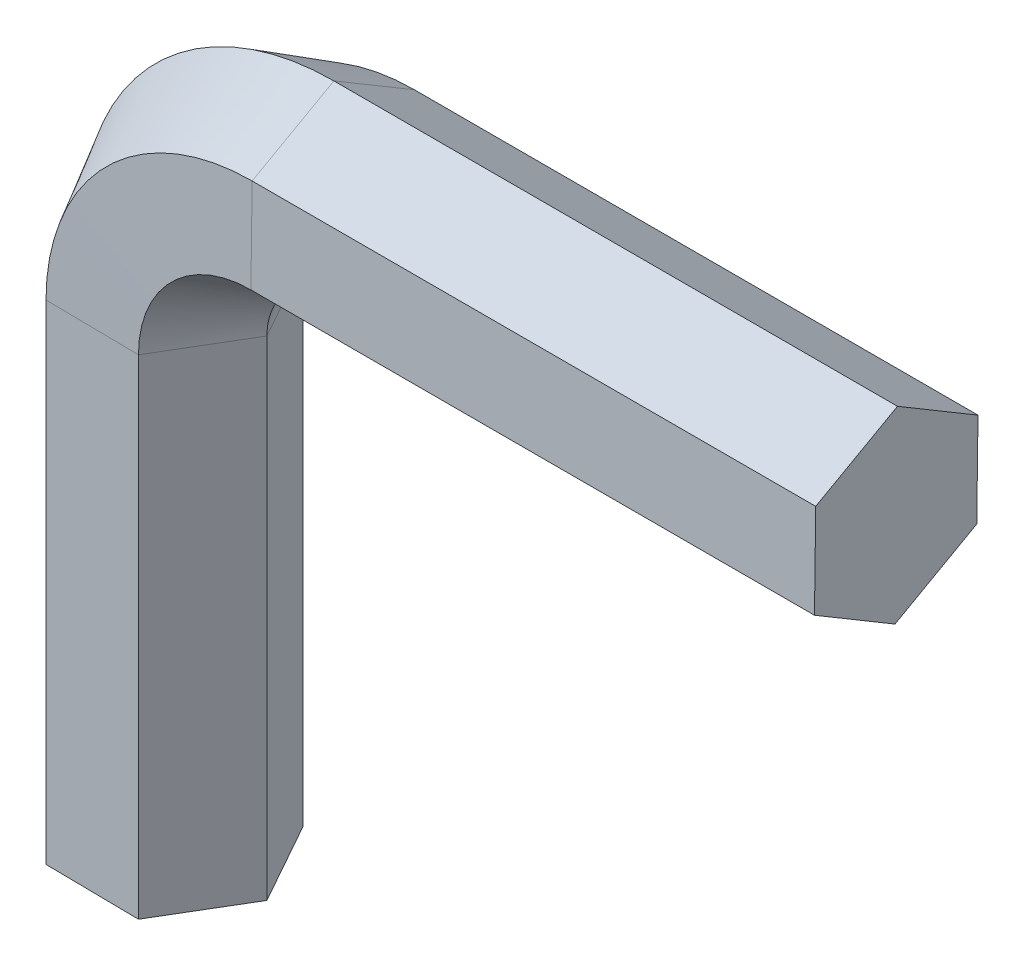
ISO-10303-21;
HEADER;
FILE_DESCRIPTION(('STEP AP214'),'2;1');
FILE_NAME('part.step','',(''),(''),'','','');
FILE_SCHEMA(('AUTOMOTIVE_DESIGN { 1 0 10303 214 1 1 1 1 }'));
ENDSEC;
DATA;
#1=APPLICATION_CONTEXT('core data for automotive mechanical design processes');
#2=APPLICATION_PROTOCOL_DEFINITION('international standard','automotive_design',2000,#1);
#3=PRODUCT_CONTEXT('',#1,'mechanical');
#4=PRODUCT('Part','Part','',(#3));
#5=PRODUCT_RELATED_PRODUCT_CATEGORY('part','',(#4));
#6=PRODUCT_DEFINITION_FORMATION('','',#4);
#7=PRODUCT_DEFINITION_CONTEXT('part definition',#1,'design');
#8=PRODUCT_DEFINITION('design','',#6,#7);
#9=PRODUCT_DEFINITION_SHAPE('','',#8);
#10=(LENGTH_UNIT() NAMED_UNIT(*) SI_UNIT(.MILLI.,.METRE.));
#11=(NAMED_UNIT(*) PLANE_ANGLE_UNIT() SI_UNIT($,.RADIAN.));
#12=(NAMED_UNIT(*) SI_UNIT($,.STERADIAN.) SOLID_ANGLE_UNIT());
#13=UNCERTAINTY_MEASURE_WITH_UNIT(LENGTH_MEASURE(1.E-05),#10,'distance_accuracy_value','');
#14=(GEOMETRIC_REPRESENTATION_CONTEXT(3) GLOBAL_UNCERTAINTY_ASSIGNED_CONTEXT((#13)) GLOBAL_UNIT_ASSIGNED_CONTEXT((#10,
#11,#12)) REPRESENTATION_CONTEXT('',''));
#15=CARTESIAN_POINT('',(0.,0.,0.));
#16=DIRECTION('',(0.,0.,1.));
#17=DIRECTION('',(1.,0.,0.));
#18=AXIS2_PLACEMENT_3D('',#15,#16,#17);
#19=CARTESIAN_POINT('',(0.,0.,0.));
#20=DIRECTION('',(0.,1.,0.));
#21=DIRECTION('',(0.,0.,1.));
#22=AXIS2_PLACEMENT_3D('',#19,#20,#21);
#23=PLANE('',#22);
#24=DIRECTION('',(0.999912109176475,0.,0.0132579757977503));
#25=VECTOR('',#24,1.);
#26=CARTESIAN_POINT('',(-4.46012358612205,0.,7.49392154961065));
#27=LINE('',#26,#25);
#28=CARTESIAN_POINT('',(-4.46012358612205,0.,7.49392154961065));
#29=VERTEX_POINT('',#28);
#30=CARTESIAN_POINT('',(4.25986464286943,0.,7.60954110440517));
#31=VERTEX_POINT('',#30);
#32=EDGE_CURVE('E198',#29,#31,#27,.T.);
#33=ORIENTED_EDGE('',*,*,#32,.F.);
#34=DIRECTION('',(0.488474310744626,0.,0.872578275997382));
#35=VECTOR('',#34,1.);
#36=CARTESIAN_POINT('',(-8.71998822899149,0.,-0.115619554794526));
#37=LINE('',#36,#35);
#38=CARTESIAN_POINT('',(-8.71998822899149,0.,-0.115619554794526));
#39=VERTEX_POINT('',#38);
#40=EDGE_CURVE('E260',#39,#29,#37,.T.);
#41=ORIENTED_EDGE('',*,*,#40,.F.);
#42=DIRECTION('',(-0.511437798431848,0.,0.859320300199631));
#43=VECTOR('',#42,1.);
#44=CARTESIAN_POINT('',(-4.25986464286944,0.,-7.60954110440517));
#45=LINE('',#44,#43);
#46=CARTESIAN_POINT('',(-4.25986464286944,0.,-7.60954110440517));
#47=VERTEX_POINT('',#46);
#48=EDGE_CURVE('E240',#47,#39,#45,.T.);
#49=ORIENTED_EDGE('',*,*,#48,.F.);
#50=DIRECTION('',(-0.999912109176475,0.,-0.0132579757977515));
#51=VECTOR('',#50,1.);
#52=CARTESIAN_POINT('',(4.46012358612204,0.,-7.49392154961064));
#53=LINE('',#52,#51);
#54=CARTESIAN_POINT('',(4.46012358612204,0.,-7.49392154961064));
#55=VERTEX_POINT('',#54);
#56=EDGE_CURVE('E145',#55,#47,#53,.T.);
#57=ORIENTED_EDGE('',*,*,#56,.F.);
#58=DIRECTION('',(-0.488474310744626,0.,-0.872578275997381));
#59=VECTOR('',#58,1.);
#60=CARTESIAN_POINT('',(8.71998822899148,0.,0.115619554794527));
#61=LINE('',#60,#59);
#62=CARTESIAN_POINT('',(8.71998822899148,0.,0.115619554794527));
#63=VERTEX_POINT('',#62);
#64=EDGE_CURVE('E149',#63,#55,#61,.T.);
#65=ORIENTED_EDGE('',*,*,#64,.F.);
#66=DIRECTION('',(0.511437798431849,0.,-0.859320300199631));
#67=VECTOR('',#66,1.);
#68=CARTESIAN_POINT('',(4.25986464286943,0.,7.60954110440517));
#69=LINE('',#68,#67);
#70=EDGE_CURVE('E154',#31,#63,#69,.T.);
#71=ORIENTED_EDGE('',*,*,#70,.F.);
#72=EDGE_LOOP('',(#33,#41,#49,#57,#65,#71));
#73=FACE_BOUND('',#72,.T.);
#74=ADVANCED_FACE('F43',(#73),#23,.F.);
#75=CARTESIAN_POINT('',(67.1770019025754,60.2210599732967,0.));
#76=DIRECTION('',(1.,0.,0.));
#77=DIRECTION('',(0.,0.,1.));
#78=AXIS2_PLACEMENT_3D('',#75,#76,#77);
#79=PLANE('',#78);
#80=DIRECTION('',(0.,-0.999912109176475,0.0132579757977503));
#81=VECTOR('',#80,1.);
#82=CARTESIAN_POINT('',(67.1770019025754,64.6811835594187,7.49392154961065));
#83=LINE('',#82,#81);
#84=CARTESIAN_POINT('',(67.1770019025754,64.6811835594187,7.49392154961065));
#85=VERTEX_POINT('',#84);
#86=CARTESIAN_POINT('',(67.1770019025754,55.9611953304272,7.60954110440517));
#87=VERTEX_POINT('',#86);
#88=EDGE_CURVE('E165',#85,#87,#83,.T.);
#89=ORIENTED_EDGE('',*,*,#88,.T.);
#90=DIRECTION('',(0.,-0.511437798431849,-0.859320300199631));
#91=VECTOR('',#90,1.);
#92=CARTESIAN_POINT('',(67.1770019025754,55.9611953304272,7.60954110440517));
#93=LINE('',#92,#91);
#94=CARTESIAN_POINT('',(67.1770019025754,51.5010717443052,0.115619554794527));
#95=VERTEX_POINT('',#94);
#96=EDGE_CURVE('E168',#87,#95,#93,.T.);
#97=ORIENTED_EDGE('',*,*,#96,.T.);
#98=DIRECTION('',(0.,0.488474310744626,-0.872578275997381));
#99=VECTOR('',#98,1.);
#100=CARTESIAN_POINT('',(67.1770019025754,51.5010717443052,0.115619554794527));
#101=LINE('',#100,#99);
#102=CARTESIAN_POINT('',(67.1770019025754,55.7609363871746,-7.49392154961064));
#103=VERTEX_POINT('',#102);
#104=EDGE_CURVE('E218',#95,#103,#101,.T.);
#105=ORIENTED_EDGE('',*,*,#104,.T.);
#106=DIRECTION('',(0.,0.999912109176475,-0.0132579757977515));
#107=VECTOR('',#106,1.);
#108=CARTESIAN_POINT('',(67.1770019025754,55.7609363871746,-7.49392154961064));
#109=LINE('',#108,#107);
#110=CARTESIAN_POINT('',(67.1770019025754,64.4809246161661,-7.60954110440517));
#111=VERTEX_POINT('',#110);
#112=EDGE_CURVE('E63',#103,#111,#109,.T.);
#113=ORIENTED_EDGE('',*,*,#112,.T.);
#114=DIRECTION('',(0.,0.511437798431848,0.859320300199631));
#115=VECTOR('',#114,1.);
#116=CARTESIAN_POINT('',(67.1770019025754,64.4809246161661,-7.60954110440517));
#117=LINE('',#116,#115);
#118=CARTESIAN_POINT('',(67.1770019025754,68.9410482022881,-0.115619554794526));
#119=VERTEX_POINT('',#118);
#120=EDGE_CURVE('E57',#111,#119,#117,.T.);
#121=ORIENTED_EDGE('',*,*,#120,.T.);
#122=DIRECTION('',(0.,-0.488474310744626,0.872578275997382));
#123=VECTOR('',#122,1.);
#124=CARTESIAN_POINT('',(67.1770019025754,68.9410482022881,-0.115619554794526));
#125=LINE('',#124,#123);
#126=EDGE_CURVE('E11',#119,#85,#125,.T.);
#127=ORIENTED_EDGE('',*,*,#126,.T.);
#128=EDGE_LOOP('',(#89,#97,#105,#113,#121,#127));
#129=FACE_BOUND('',#128,.T.);
#130=ADVANCED_FACE('F167',(#129),#79,.T.);
#131=CARTESIAN_POINT('',(-4.46012358612205,0.,7.49392154961065));
#132=DIRECTION('',(-0.0132579757977503,0.,0.999912109176475));
#133=DIRECTION('',(0.999912109176475,0.,0.0132579757977503));
#134=AXIS2_PLACEMENT_3D('',#131,#132,#133);
#135=PLANE('',#134);
#136=DIRECTION('',(0.,1.,0.));
#137=VECTOR('',#136,1.);
#138=CARTESIAN_POINT('',(4.25986464286943,0.,7.60954110440517));
#139=LINE('',#138,#137);
#140=CARTESIAN_POINT('',(4.25986464286943,45.4952210891904,7.60954110440517));
#141=VERTEX_POINT('',#140);
#142=EDGE_CURVE('E204',#31,#141,#139,.T.);
#143=ORIENTED_EDGE('',*,*,#142,.T.);
#144=DIRECTION('',(0.999912109176475,0.,0.0132579757977503));
#145=VECTOR('',#144,1.);
#146=CARTESIAN_POINT('',(-4.46012358612205,45.4952210891904,7.49392154961065));
#147=LINE('',#146,#145);
#148=CARTESIAN_POINT('',(-4.46012358612205,45.4952210891904,7.49392154961065));
#149=VERTEX_POINT('',#148);
#150=EDGE_CURVE('E305',#149,#141,#147,.T.);
#151=ORIENTED_EDGE('',*,*,#150,.F.);
#152=DIRECTION('',(0.,1.,0.));
#153=VECTOR('',#152,1.);
#154=CARTESIAN_POINT('',(-4.46012358612205,0.,7.49392154961065));
#155=LINE('',#154,#153);
#156=EDGE_CURVE('E281',#29,#149,#155,.T.);
#157=ORIENTED_EDGE('',*,*,#156,.F.);
#158=ORIENTED_EDGE('',*,*,#32,.T.);
#159=EDGE_LOOP('',(#143,#151,#157,#158));
#160=FACE_BOUND('',#159,.T.);
#161=ADVANCED_FACE('F315',(#160),#135,.T.);
#162=CARTESIAN_POINT('',(4.25986464286943,0.,7.60954110440517));
#163=DIRECTION('',(0.859320300199631,0.,0.511437798431849));
#164=DIRECTION('',(0.511437798431849,0.,-0.859320300199631));
#165=AXIS2_PLACEMENT_3D('',#162,#163,#164);
#166=PLANE('',#165);
#167=DIRECTION('',(0.,1.,0.));
#168=VECTOR('',#167,1.);
#169=CARTESIAN_POINT('',(8.71998822899148,0.,0.115619554794527));
#170=LINE('',#169,#168);
#171=CARTESIAN_POINT('',(8.71998822899148,45.4952210891904,0.115619554794527));
#172=VERTEX_POINT('',#171);
#173=EDGE_CURVE('E203',#63,#172,#170,.T.);
#174=ORIENTED_EDGE('',*,*,#173,.T.);
#175=DIRECTION('',(0.511437798431849,0.,-0.859320300199631));
#176=VECTOR('',#175,1.);
#177=CARTESIAN_POINT('',(4.25986464286943,45.4952210891904,7.60954110440517));
#178=LINE('',#177,#176);
#179=EDGE_CURVE('E199',#141,#172,#178,.T.);
#180=ORIENTED_EDGE('',*,*,#179,.F.);
#181=ORIENTED_EDGE('',*,*,#142,.F.);
#182=ORIENTED_EDGE('',*,*,#70,.T.);
#183=EDGE_LOOP('',(#174,#180,#181,#182));
#184=FACE_BOUND('',#183,.T.);
#185=ADVANCED_FACE('F318',(#184),#166,.T.);
#186=CARTESIAN_POINT('',(8.71998822899148,0.,0.115619554794527));
#187=DIRECTION('',(0.872578275997382,0.,-0.488474310744626));
#188=DIRECTION('',(-0.488474310744626,0.,-0.872578275997382));
#189=AXIS2_PLACEMENT_3D('',#186,#187,#188);
#190=PLANE('',#189);
#191=DIRECTION('',(0.,1.,0.));
#192=VECTOR('',#191,1.);
#193=CARTESIAN_POINT('',(4.46012358612204,0.,-7.49392154961064));
#194=LINE('',#193,#192);
#195=CARTESIAN_POINT('',(4.46012358612204,45.4952210891904,-7.49392154961064));
#196=VERTEX_POINT('',#195);
#197=EDGE_CURVE('E223',#55,#196,#194,.T.);
#198=ORIENTED_EDGE('',*,*,#197,.T.);
#199=DIRECTION('',(-0.488474310744626,0.,-0.872578275997381));
#200=VECTOR('',#199,1.);
#201=CARTESIAN_POINT('',(8.71998822899148,45.4952210891904,0.115619554794527));
#202=LINE('',#201,#200);
#203=EDGE_CURVE('E208',#172,#196,#202,.T.);
#204=ORIENTED_EDGE('',*,*,#203,.F.);
#205=ORIENTED_EDGE('',*,*,#173,.F.);
#206=ORIENTED_EDGE('',*,*,#64,.T.);
#207=EDGE_LOOP('',(#198,#204,#205,#206));
#208=FACE_BOUND('',#207,.T.);
#209=ADVANCED_FACE('F375',(#208),#190,.T.);
#210=CARTESIAN_POINT('',(4.46012358612204,0.,-7.49392154961064));
#211=DIRECTION('',(0.0132579757977515,0.,-0.999912109176475));
#212=DIRECTION('',(-0.999912109176475,0.,-0.0132579757977515));
#213=AXIS2_PLACEMENT_3D('',#210,#211,#212);
#214=PLANE('',#213);
#215=DIRECTION('',(0.,1.,0.));
#216=VECTOR('',#215,1.);
#217=CARTESIAN_POINT('',(-4.25986464286944,0.,-7.60954110440517));
#218=LINE('',#217,#216);
#219=CARTESIAN_POINT('',(-4.25986464286944,45.4952210891904,-7.60954110440517));
#220=VERTEX_POINT('',#219);
#221=EDGE_CURVE('E243',#47,#220,#218,.T.);
#222=ORIENTED_EDGE('',*,*,#221,.T.);
#223=DIRECTION('',(-0.999912109176475,0.,-0.0132579757977515));
#224=VECTOR('',#223,1.);
#225=CARTESIAN_POINT('',(4.46012358612204,45.4952210891904,-7.49392154961064));
#226=LINE('',#225,#224);
#227=EDGE_CURVE('E227',#196,#220,#226,.T.);
#228=ORIENTED_EDGE('',*,*,#227,.F.);
#229=ORIENTED_EDGE('',*,*,#197,.F.);
#230=ORIENTED_EDGE('',*,*,#56,.T.);
#231=EDGE_LOOP('',(#222,#228,#229,#230));
#232=FACE_BOUND('',#231,.T.);
#233=ADVANCED_FACE('F384',(#232),#214,.T.);
#234=CARTESIAN_POINT('',(-4.25986464286944,0.,-7.60954110440517));
#235=DIRECTION('',(-0.859320300199631,0.,-0.511437798431848));
#236=DIRECTION('',(-0.511437798431848,0.,0.859320300199631));
#237=AXIS2_PLACEMENT_3D('',#234,#235,#236);
#238=PLANE('',#237);
#239=DIRECTION('',(0.,1.,0.));
#240=VECTOR('',#239,1.);
#241=CARTESIAN_POINT('',(-8.71998822899149,0.,-0.115619554794526));
#242=LINE('',#241,#240);
#243=CARTESIAN_POINT('',(-8.71998822899149,45.4952210891904,-0.115619554794526));
#244=VERTEX_POINT('',#243);
#245=EDGE_CURVE('E263',#39,#244,#242,.T.);
#246=ORIENTED_EDGE('',*,*,#245,.T.);
#247=DIRECTION('',(-0.511437798431848,0.,0.859320300199631));
#248=VECTOR('',#247,1.);
#249=CARTESIAN_POINT('',(-4.25986464286944,45.4952210891904,-7.60954110440517));
#250=LINE('',#249,#248);
#251=EDGE_CURVE('E247',#220,#244,#250,.T.);
#252=ORIENTED_EDGE('',*,*,#251,.F.);
#253=ORIENTED_EDGE('',*,*,#221,.F.);
#254=ORIENTED_EDGE('',*,*,#48,.T.);
#255=EDGE_LOOP('',(#246,#252,#253,#254));
#256=FACE_BOUND('',#255,.T.);
#257=ADVANCED_FACE('F395',(#256),#238,.T.);
#258=CARTESIAN_POINT('',(-8.71998822899149,0.,-0.115619554794526));
#259=DIRECTION('',(-0.872578275997382,0.,0.488474310744626));
#260=DIRECTION('',(0.488474310744626,0.,0.872578275997382));
#261=AXIS2_PLACEMENT_3D('',#258,#259,#260);
#262=PLANE('',#261);
#263=DIRECTION('',(0.488474310744626,0.,0.872578275997382));
#264=VECTOR('',#263,1.);
#265=CARTESIAN_POINT('',(-8.71998822899149,45.4952210891904,-0.115619554794526));
#266=LINE('',#265,#264);
#267=EDGE_CURVE('E267',#244,#149,#266,.T.);
#268=ORIENTED_EDGE('',*,*,#267,.F.);
#269=ORIENTED_EDGE('',*,*,#245,.F.);
#270=ORIENTED_EDGE('',*,*,#40,.T.);
#271=ORIENTED_EDGE('',*,*,#156,.T.);
#272=EDGE_LOOP('',(#268,#269,#270,#271));
#273=FACE_BOUND('',#272,.T.);
#274=ADVANCED_FACE('F331',(#273),#262,.T.);
#275=CARTESIAN_POINT('',(14.7258388841062,45.4952210891904,7.49392154961065));
#276=DIRECTION('',(0.,0.,-1.));
#277=DIRECTION('',(-1.,0.,0.));
#278=AXIS2_PLACEMENT_3D('',#275,#276,#277);
#279=CONICAL_SURFACE('',#278,19.1859624702283,1.55753796256535);
#280=CARTESIAN_POINT('',(14.7258388841062,45.4952210891904,7.60954110440517));
#281=DIRECTION('',(0.,0.,-1.));
#282=DIRECTION('',(-1.,0.,0.));
#283=AXIS2_PLACEMENT_3D('',#280,#281,#282);
#284=CIRCLE('',#283,10.4659742412368);
#285=CARTESIAN_POINT('',(14.7258388841062,55.9611953304272,7.60954110440517));
#286=VERTEX_POINT('',#285);
#287=EDGE_CURVE('E212',#141,#286,#284,.T.);
#288=ORIENTED_EDGE('',*,*,#287,.T.);
#289=DIRECTION('',(0.,-0.999912109176475,0.0132579757977503));
#290=VECTOR('',#289,1.);
#291=CARTESIAN_POINT('',(14.7258388841062,64.6811835594187,7.49392154961065));
#292=LINE('',#291,#290);
#293=CARTESIAN_POINT('',(14.7258388841062,64.6811835594187,7.49392154961065));
#294=VERTEX_POINT('',#293);
#295=EDGE_CURVE('E188',#294,#286,#292,.T.);
#296=ORIENTED_EDGE('',*,*,#295,.F.);
#297=CARTESIAN_POINT('',(14.7258388841062,45.4952210891904,7.49392154961065));
#298=DIRECTION('',(0.,0.,-1.));
#299=DIRECTION('',(-1.,0.,0.));
#300=AXIS2_PLACEMENT_3D('',#297,#298,#299);
#301=CIRCLE('',#300,19.1859624702283);
#302=EDGE_CURVE('E284',#149,#294,#301,.T.);
#303=ORIENTED_EDGE('',*,*,#302,.F.);
#304=ORIENTED_EDGE('',*,*,#150,.T.);
#305=EDGE_LOOP('',(#288,#296,#303,#304));
#306=FACE_BOUND('',#305,.T.);
#307=ADVANCED_FACE('F291',(#306),#279,.T.);
#308=CARTESIAN_POINT('',(14.7258388841062,45.4952210891904,7.60954110440517));
#309=DIRECTION('',(0.,0.,1.));
#310=DIRECTION('',(1.,0.,0.));
#311=AXIS2_PLACEMENT_3D('',#308,#309,#310);
#312=CONICAL_SURFACE('',#311,10.4659742412368,0.536857139827842);
#313=CARTESIAN_POINT('',(14.7258388841062,45.4952210891904,0.115619554794527));
#314=DIRECTION('',(0.,0.,-1.));
#315=DIRECTION('',(-1.,0.,0.));
#316=AXIS2_PLACEMENT_3D('',#313,#314,#315);
#317=CIRCLE('',#316,6.00585065511476);
#318=CARTESIAN_POINT('',(14.7258388841062,51.5010717443052,0.115619554794527));
#319=VERTEX_POINT('',#318);
#320=EDGE_CURVE('E132',#172,#319,#317,.T.);
#321=ORIENTED_EDGE('',*,*,#320,.T.);
#322=DIRECTION('',(0.,-0.511437798431849,-0.859320300199631));
#323=VECTOR('',#322,1.);
#324=CARTESIAN_POINT('',(14.7258388841062,55.9611953304272,7.60954110440517));
#325=LINE('',#324,#323);
#326=EDGE_CURVE('E209',#286,#319,#325,.T.);
#327=ORIENTED_EDGE('',*,*,#326,.F.);
#328=ORIENTED_EDGE('',*,*,#287,.F.);
#329=ORIENTED_EDGE('',*,*,#179,.T.);
#330=EDGE_LOOP('',(#321,#327,#328,#329));
#331=FACE_BOUND('',#330,.T.);
#332=ADVANCED_FACE('F321',(#331),#312,.F.);
#333=CARTESIAN_POINT('',(14.7258388841062,45.4952210891904,0.115619554794527));
#334=DIRECTION('',(0.,0.,-1.));
#335=DIRECTION('',(-1.,0.,0.));
#336=AXIS2_PLACEMENT_3D('',#333,#334,#335);
#337=CONICAL_SURFACE('',#336,6.00585065511476,0.510340411368755);
#338=CARTESIAN_POINT('',(14.7258388841062,45.4952210891904,-7.49392154961064));
#339=DIRECTION('',(0.,0.,-1.));
#340=DIRECTION('',(-1.,0.,0.));
#341=AXIS2_PLACEMENT_3D('',#338,#339,#340);
#342=CIRCLE('',#341,10.2657152979842);
#343=CARTESIAN_POINT('',(14.7258388841062,55.7609363871746,-7.49392154961064));
#344=VERTEX_POINT('',#343);
#345=EDGE_CURVE('E123',#196,#344,#342,.T.);
#346=ORIENTED_EDGE('',*,*,#345,.T.);
#347=DIRECTION('',(0.,0.488474310744626,-0.872578275997381));
#348=VECTOR('',#347,1.);
#349=CARTESIAN_POINT('',(14.7258388841062,51.5010717443052,0.115619554794527));
#350=LINE('',#349,#348);
#351=EDGE_CURVE('E214',#319,#344,#350,.T.);
#352=ORIENTED_EDGE('',*,*,#351,.F.);
#353=ORIENTED_EDGE('',*,*,#320,.F.);
#354=ORIENTED_EDGE('',*,*,#203,.T.);
#355=EDGE_LOOP('',(#346,#352,#353,#354));
#356=FACE_BOUND('',#355,.T.);
#357=ADVANCED_FACE('F323',(#356),#337,.F.);
#358=CARTESIAN_POINT('',(14.7258388841062,45.4952210891904,-7.49392154961064));
#359=DIRECTION('',(0.,0.,-1.));
#360=DIRECTION('',(-1.,0.,0.));
#361=AXIS2_PLACEMENT_3D('',#358,#359,#360);
#362=CONICAL_SURFACE('',#361,10.2657152979842,1.55753796256535);
#363=CARTESIAN_POINT('',(14.7258388841062,45.4952210891904,-7.60954110440517));
#364=DIRECTION('',(0.,0.,-1.));
#365=DIRECTION('',(-1.,0.,0.));
#366=AXIS2_PLACEMENT_3D('',#363,#364,#365);
#367=CIRCLE('',#366,18.9857035269757);
#368=CARTESIAN_POINT('',(14.7258388841062,64.4809246161661,-7.60954110440517));
#369=VERTEX_POINT('',#368);
#370=EDGE_CURVE('E116',#220,#369,#367,.T.);
#371=ORIENTED_EDGE('',*,*,#370,.T.);
#372=DIRECTION('',(0.,0.999912109176475,-0.0132579757977515));
#373=VECTOR('',#372,1.);
#374=CARTESIAN_POINT('',(14.7258388841062,55.7609363871746,-7.49392154961064));
#375=LINE('',#374,#373);
#376=EDGE_CURVE('E233',#344,#369,#375,.T.);
#377=ORIENTED_EDGE('',*,*,#376,.F.);
#378=ORIENTED_EDGE('',*,*,#345,.F.);
#379=ORIENTED_EDGE('',*,*,#227,.T.);
#380=EDGE_LOOP('',(#371,#377,#378,#379));
#381=FACE_BOUND('',#380,.T.);
#382=ADVANCED_FACE('F329',(#381),#362,.F.);
#383=CARTESIAN_POINT('',(14.7258388841062,45.4952210891904,-7.60954110440517));
#384=DIRECTION('',(0.,0.,1.));
#385=DIRECTION('',(1.,0.,0.));
#386=AXIS2_PLACEMENT_3D('',#383,#384,#385);
#387=CONICAL_SURFACE('',#386,18.9857035269757,0.536857139827842);
#388=CARTESIAN_POINT('',(14.7258388841062,45.4952210891904,-0.115619554794526));
#389=DIRECTION('',(0.,0.,-1.));
#390=DIRECTION('',(-1.,0.,0.));
#391=AXIS2_PLACEMENT_3D('',#388,#389,#390);
#392=CIRCLE('',#391,23.4458271130977);
#393=CARTESIAN_POINT('',(14.7258388841062,68.9410482022881,-0.115619554794526));
#394=VERTEX_POINT('',#393);
#395=EDGE_CURVE('E270',#244,#394,#392,.T.);
#396=ORIENTED_EDGE('',*,*,#395,.T.);
#397=DIRECTION('',(0.,0.511437798431848,0.859320300199631));
#398=VECTOR('',#397,1.);
#399=CARTESIAN_POINT('',(14.7258388841062,64.4809246161661,-7.60954110440517));
#400=LINE('',#399,#398);
#401=EDGE_CURVE('E252',#369,#394,#400,.T.);
#402=ORIENTED_EDGE('',*,*,#401,.F.);
#403=ORIENTED_EDGE('',*,*,#370,.F.);
#404=ORIENTED_EDGE('',*,*,#251,.T.);
#405=EDGE_LOOP('',(#396,#402,#403,#404));
#406=FACE_BOUND('',#405,.T.);
#407=ADVANCED_FACE('F444',(#406),#387,.T.);
#408=CARTESIAN_POINT('',(14.7258388841062,45.4952210891904,-0.115619554794526));
#409=DIRECTION('',(0.,0.,-1.));
#410=DIRECTION('',(-1.,0.,0.));
#411=AXIS2_PLACEMENT_3D('',#408,#409,#410);
#412=CONICAL_SURFACE('',#411,23.4458271130977,0.510340411368755);
#413=DIRECTION('',(0.,-0.488474310744626,0.872578275997382));
#414=VECTOR('',#413,1.);
#415=CARTESIAN_POINT('',(14.7258388841062,68.9410482022881,-0.115619554794526));
#416=LINE('',#415,#414);
#417=EDGE_CURVE('E195',#394,#294,#416,.T.);
#418=ORIENTED_EDGE('',*,*,#417,.F.);
#419=ORIENTED_EDGE('',*,*,#395,.F.);
#420=ORIENTED_EDGE('',*,*,#267,.T.);
#421=ORIENTED_EDGE('',*,*,#302,.T.);
#422=EDGE_LOOP('',(#418,#419,#420,#421));
#423=FACE_BOUND('',#422,.T.);
#424=ADVANCED_FACE('F295',(#423),#412,.T.);
#425=CARTESIAN_POINT('',(14.7258388841062,64.6811835594187,7.49392154961065));
#426=DIRECTION('',(0.,0.0132579757977503,0.999912109176475));
#427=DIRECTION('',(0.,-0.999912109176475,0.0132579757977503));
#428=AXIS2_PLACEMENT_3D('',#425,#426,#427);
#429=PLANE('',#428);
#430=DIRECTION('',(1.,0.,0.));
#431=VECTOR('',#430,1.);
#432=CARTESIAN_POINT('',(14.7258388841062,55.9611953304272,7.60954110440517));
#433=LINE('',#432,#431);
#434=EDGE_CURVE('E174',#286,#87,#433,.T.);
#435=ORIENTED_EDGE('',*,*,#434,.T.);
#436=ORIENTED_EDGE('',*,*,#88,.F.);
#437=DIRECTION('',(1.,0.,0.));
#438=VECTOR('',#437,1.);
#439=CARTESIAN_POINT('',(14.7258388841062,64.6811835594187,7.49392154961065));
#440=LINE('',#439,#438);
#441=EDGE_CURVE('E175',#294,#85,#440,.T.);
#442=ORIENTED_EDGE('',*,*,#441,.F.);
#443=ORIENTED_EDGE('',*,*,#295,.T.);
#444=EDGE_LOOP('',(#435,#436,#442,#443));
#445=FACE_BOUND('',#444,.T.);
#446=ADVANCED_FACE('F186',(#445),#429,.T.);
#447=CARTESIAN_POINT('',(14.7258388841062,55.9611953304272,7.60954110440517));
#448=DIRECTION('',(0.,-0.859320300199631,0.511437798431849));
#449=DIRECTION('',(0.,-0.511437798431849,-0.859320300199631));
#450=AXIS2_PLACEMENT_3D('',#447,#448,#449);
#451=PLANE('',#450);
#452=DIRECTION('',(1.,0.,0.));
#453=VECTOR('',#452,1.);
#454=CARTESIAN_POINT('',(14.7258388841062,51.5010717443052,0.115619554794527));
#455=LINE('',#454,#453);
#456=EDGE_CURVE('E182',#319,#95,#455,.T.);
#457=ORIENTED_EDGE('',*,*,#456,.T.);
#458=ORIENTED_EDGE('',*,*,#96,.F.);
#459=ORIENTED_EDGE('',*,*,#434,.F.);
#460=ORIENTED_EDGE('',*,*,#326,.T.);
#461=EDGE_LOOP('',(#457,#458,#459,#460));
#462=FACE_BOUND('',#461,.T.);
#463=ADVANCED_FACE('F179',(#462),#451,.T.);
#464=CARTESIAN_POINT('',(14.7258388841062,51.5010717443052,0.115619554794527));
#465=DIRECTION('',(0.,-0.872578275997382,-0.488474310744626));
#466=DIRECTION('',(0.,0.488474310744626,-0.872578275997382));
#467=AXIS2_PLACEMENT_3D('',#464,#465,#466);
#468=PLANE('',#467);
#469=DIRECTION('',(1.,0.,0.));
#470=VECTOR('',#469,1.);
#471=CARTESIAN_POINT('',(14.7258388841062,55.7609363871746,-7.49392154961064));
#472=LINE('',#471,#470);
#473=EDGE_CURVE('E101',#344,#103,#472,.T.);
#474=ORIENTED_EDGE('',*,*,#473,.T.);
#475=ORIENTED_EDGE('',*,*,#104,.F.);
#476=ORIENTED_EDGE('',*,*,#456,.F.);
#477=ORIENTED_EDGE('',*,*,#351,.T.);
#478=EDGE_LOOP('',(#474,#475,#476,#477));
#479=FACE_BOUND('',#478,.T.);
#480=ADVANCED_FACE('F480',(#479),#468,.T.);
#481=CARTESIAN_POINT('',(14.7258388841062,55.7609363871746,-7.49392154961064));
#482=DIRECTION('',(0.,-0.0132579757977515,-0.999912109176475));
#483=DIRECTION('',(0.,0.999912109176475,-0.0132579757977515));
#484=AXIS2_PLACEMENT_3D('',#481,#482,#483);
#485=PLANE('',#484);
#486=DIRECTION('',(1.,0.,0.));
#487=VECTOR('',#486,1.);
#488=CARTESIAN_POINT('',(14.7258388841062,64.4809246161661,-7.60954110440517));
#489=LINE('',#488,#487);
#490=EDGE_CURVE('E93',#369,#111,#489,.T.);
#491=ORIENTED_EDGE('',*,*,#490,.T.);
#492=ORIENTED_EDGE('',*,*,#112,.F.);
#493=ORIENTED_EDGE('',*,*,#473,.F.);
#494=ORIENTED_EDGE('',*,*,#376,.T.);
#495=EDGE_LOOP('',(#491,#492,#493,#494));
#496=FACE_BOUND('',#495,.T.);
#497=ADVANCED_FACE('F341',(#496),#485,.T.);
#498=CARTESIAN_POINT('',(14.7258388841062,64.4809246161661,-7.60954110440517));
#499=DIRECTION('',(0.,0.859320300199631,-0.511437798431848));
#500=DIRECTION('',(0.,0.511437798431848,0.859320300199631));
#501=AXIS2_PLACEMENT_3D('',#498,#499,#500);
#502=PLANE('',#501);
#503=DIRECTION('',(1.,0.,0.));
#504=VECTOR('',#503,1.);
#505=CARTESIAN_POINT('',(14.7258388841062,68.9410482022881,-0.115619554794526));
#506=LINE('',#505,#504);
#507=EDGE_CURVE('E51',#394,#119,#506,.T.);
#508=ORIENTED_EDGE('',*,*,#507,.T.);
#509=ORIENTED_EDGE('',*,*,#120,.F.);
#510=ORIENTED_EDGE('',*,*,#490,.F.);
#511=ORIENTED_EDGE('',*,*,#401,.T.);
#512=EDGE_LOOP('',(#508,#509,#510,#511));
#513=FACE_BOUND('',#512,.T.);
#514=ADVANCED_FACE('F336',(#513),#502,.T.);
#515=CARTESIAN_POINT('',(14.7258388841062,68.9410482022881,-0.115619554794526));
#516=DIRECTION('',(0.,0.872578275997382,0.488474310744626));
#517=DIRECTION('',(0.,-0.488474310744626,0.872578275997382));
#518=AXIS2_PLACEMENT_3D('',#515,#516,#517);
#519=PLANE('',#518);
#520=ORIENTED_EDGE('',*,*,#126,.F.);
#521=ORIENTED_EDGE('',*,*,#507,.F.);
#522=ORIENTED_EDGE('',*,*,#417,.T.);
#523=ORIENTED_EDGE('',*,*,#441,.T.);
#524=EDGE_LOOP('',(#520,#521,#522,#523));
#525=FACE_BOUND('',#524,.T.);
#526=ADVANCED_FACE('F286',(#525),#519,.T.);
#527=CLOSED_SHELL('',(#74,#130,#161,#185,#209,#233,#257,#274,#307,#332,#357,#382,#407,#424,#446,
#463,#480,#497,#514,#526));
#528=MANIFOLD_SOLID_BREP('B2',#527);
#529=ADVANCED_BREP_SHAPE_REPRESENTATION('',(#18,#528),#14);
#530=SHAPE_DEFINITION_REPRESENTATION(#9,#529);
ENDSEC;
END-ISO-10303-21;
